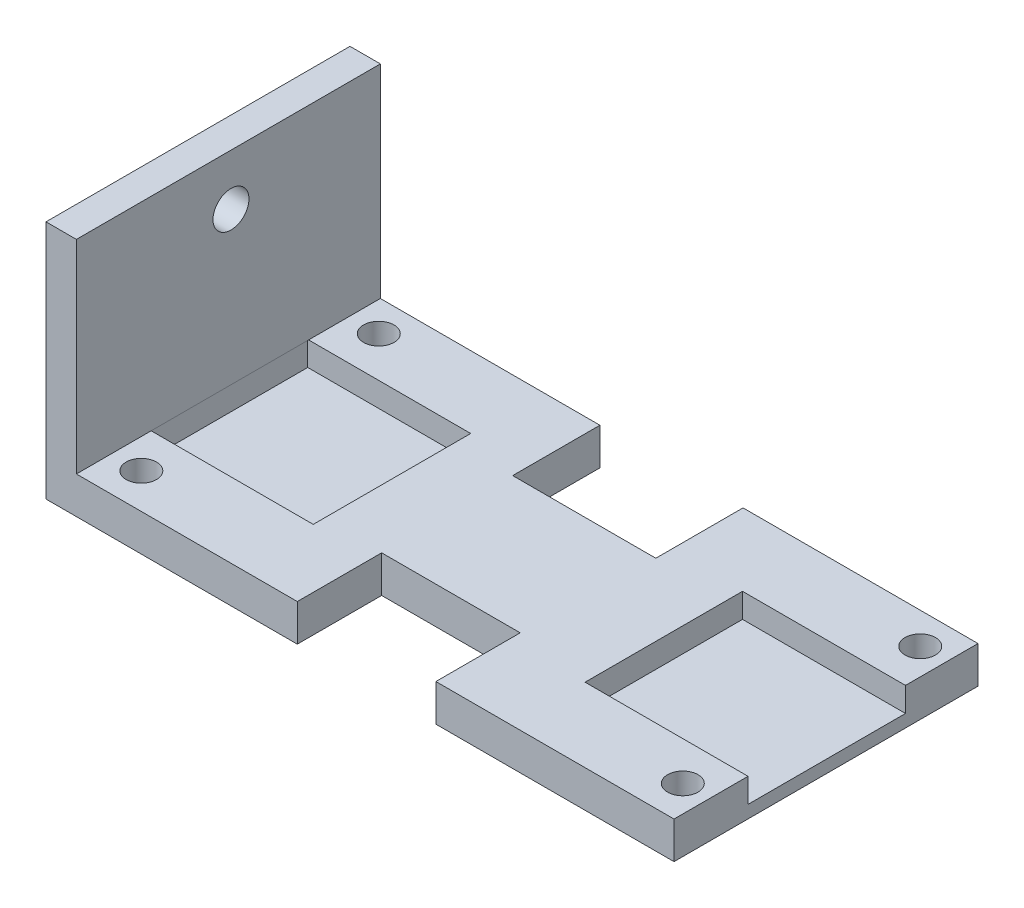
ISO-10303-21;
HEADER;
FILE_DESCRIPTION(('STEP AP214'),'2;1');
FILE_NAME('part.step','',(''),(''),'','','');
FILE_SCHEMA(('AUTOMOTIVE_DESIGN { 1 0 10303 214 1 1 1 1 }'));
ENDSEC;
DATA;
#1=APPLICATION_CONTEXT('core data for automotive mechanical design processes');
#2=APPLICATION_PROTOCOL_DEFINITION('international standard','automotive_design',2000,#1);
#3=PRODUCT_CONTEXT('',#1,'mechanical');
#4=PRODUCT('Part','Part','',(#3));
#5=PRODUCT_RELATED_PRODUCT_CATEGORY('part','',(#4));
#6=PRODUCT_DEFINITION_FORMATION('','',#4);
#7=PRODUCT_DEFINITION_CONTEXT('part definition',#1,'design');
#8=PRODUCT_DEFINITION('design','',#6,#7);
#9=PRODUCT_DEFINITION_SHAPE('','',#8);
#10=(LENGTH_UNIT() NAMED_UNIT(*) SI_UNIT(.MILLI.,.METRE.));
#11=(NAMED_UNIT(*) PLANE_ANGLE_UNIT() SI_UNIT($,.RADIAN.));
#12=(NAMED_UNIT(*) SI_UNIT($,.STERADIAN.) SOLID_ANGLE_UNIT());
#13=UNCERTAINTY_MEASURE_WITH_UNIT(LENGTH_MEASURE(1.E-05),#10,'distance_accuracy_value','');
#14=(GEOMETRIC_REPRESENTATION_CONTEXT(3) GLOBAL_UNCERTAINTY_ASSIGNED_CONTEXT((#13)) GLOBAL_UNIT_ASSIGNED_CONTEXT((#10,
#11,#12)) REPRESENTATION_CONTEXT('',''));
#15=CARTESIAN_POINT('',(0.,0.,0.));
#16=DIRECTION('',(0.,0.,1.));
#17=DIRECTION('',(1.,0.,0.));
#18=AXIS2_PLACEMENT_3D('',#15,#16,#17);
#19=CARTESIAN_POINT('',(-2.54,-12.5566261848398,6.15573617171977));
#20=DIRECTION('',(0.,0.,1.));
#21=DIRECTION('',(1.,0.,0.));
#22=AXIS2_PLACEMENT_3D('',#19,#20,#21);
#23=PLANE('',#22);
#24=DIRECTION('',(1.,0.,0.));
#25=VECTOR('',#24,1.);
#26=CARTESIAN_POINT('',(-2.54,7.5068337961804,6.15573617171977));
#27=LINE('',#26,#25);
#28=CARTESIAN_POINT('',(-2.54,7.5068337961804,6.15573617171977));
#29=VERTEX_POINT('',#28);
#30=CARTESIAN_POINT('',(0.,7.5068337961804,6.15573617171977));
#31=VERTEX_POINT('',#30);
#32=EDGE_CURVE('E191',#29,#31,#27,.T.);
#33=ORIENTED_EDGE('',*,*,#32,.F.);
#34=DIRECTION('',(0.,-1.,0.));
#35=VECTOR('',#34,1.);
#36=CARTESIAN_POINT('',(-2.54,-12.5566261848398,6.15573617171977));
#37=LINE('',#36,#35);
#38=CARTESIAN_POINT('',(-2.54,-12.5566261848398,6.15573617171977));
#39=VERTEX_POINT('',#38);
#40=EDGE_CURVE('E202',#29,#39,#37,.T.);
#41=ORIENTED_EDGE('',*,*,#40,.T.);
#42=DIRECTION('',(1.,0.,0.));
#43=VECTOR('',#42,1.);
#44=CARTESIAN_POINT('',(-2.54,-12.5566261848398,6.15573617171977));
#45=LINE('',#44,#43);
#46=CARTESIAN_POINT('',(18.4588445874283,-12.5566261848398,6.15573617171977));
#47=VERTEX_POINT('',#46);
#48=EDGE_CURVE('E229',#39,#47,#45,.T.);
#49=ORIENTED_EDGE('',*,*,#48,.T.);
#50=DIRECTION('',(0.,-1.,0.));
#51=VECTOR('',#50,1.);
#52=CARTESIAN_POINT('',(18.4588445874283,-12.5566261848398,6.15573617171977));
#53=LINE('',#52,#51);
#54=CARTESIAN_POINT('',(18.4588445874283,-9.46994199872275,6.15573617171976));
#55=VERTEX_POINT('',#54);
#56=EDGE_CURVE('E355',#55,#47,#53,.T.);
#57=ORIENTED_EDGE('',*,*,#56,.F.);
#58=DIRECTION('',(-1.,0.,0.));
#59=VECTOR('',#58,1.);
#60=CARTESIAN_POINT('',(49.9364,-9.46994199872275,6.15573617171977));
#61=LINE('',#60,#59);
#62=CARTESIAN_POINT('',(0.,-9.46994199872275,6.15573617171977));
#63=VERTEX_POINT('',#62);
#64=EDGE_CURVE('E239',#55,#63,#61,.T.);
#65=ORIENTED_EDGE('',*,*,#64,.T.);
#66=DIRECTION('',(0.,-1.,0.));
#67=VECTOR('',#66,1.);
#68=CARTESIAN_POINT('',(0.,-12.5566261848398,6.15573617171977));
#69=LINE('',#68,#67);
#70=EDGE_CURVE('E37',#31,#63,#69,.T.);
#71=ORIENTED_EDGE('',*,*,#70,.F.);
#72=EDGE_LOOP('',(#33,#41,#49,#57,#65,#71));
#73=FACE_BOUND('',#72,.T.);
#74=ADVANCED_FACE('F33',(#73),#23,.T.);
#75=CARTESIAN_POINT('',(-2.54,-12.5566261848398,-19.2442638282802));
#76=DIRECTION('',(0.,0.,-1.));
#77=DIRECTION('',(-1.,0.,0.));
#78=AXIS2_PLACEMENT_3D('',#75,#76,#77);
#79=PLANE('',#78);
#80=DIRECTION('',(1.,0.,0.));
#81=VECTOR('',#80,1.);
#82=CARTESIAN_POINT('',(-2.54,7.5068337961804,-19.2442638282802));
#83=LINE('',#82,#81);
#84=CARTESIAN_POINT('',(-2.54,7.5068337961804,-19.2442638282802));
#85=VERTEX_POINT('',#84);
#86=CARTESIAN_POINT('',(0.,7.5068337961804,-19.2442638282802));
#87=VERTEX_POINT('',#86);
#88=EDGE_CURVE('E50',#85,#87,#83,.T.);
#89=ORIENTED_EDGE('',*,*,#88,.T.);
#90=DIRECTION('',(0.,1.,0.));
#91=VECTOR('',#90,1.);
#92=CARTESIAN_POINT('',(0.,-12.5566261848398,-19.2442638282802));
#93=LINE('',#92,#91);
#94=CARTESIAN_POINT('',(0.,-9.46994199872275,-19.2442638282802));
#95=VERTEX_POINT('',#94);
#96=EDGE_CURVE('E211',#95,#87,#93,.T.);
#97=ORIENTED_EDGE('',*,*,#96,.F.);
#98=DIRECTION('',(-1.,0.,0.));
#99=VECTOR('',#98,1.);
#100=CARTESIAN_POINT('',(49.9364,-9.46994199872275,-19.2442638282802));
#101=LINE('',#100,#99);
#102=CARTESIAN_POINT('',(18.3432816390834,-9.46994199872275,-19.2442638282802));
#103=VERTEX_POINT('',#102);
#104=EDGE_CURVE('E238',#103,#95,#101,.T.);
#105=ORIENTED_EDGE('',*,*,#104,.F.);
#106=DIRECTION('',(0.,1.,0.));
#107=VECTOR('',#106,1.);
#108=CARTESIAN_POINT('',(18.3432816390834,-14.5499419987228,-19.2442638282802));
#109=LINE('',#108,#107);
#110=CARTESIAN_POINT('',(18.3432816390834,-12.5566261848398,-19.2442638282802));
#111=VERTEX_POINT('',#110);
#112=EDGE_CURVE('E365',#111,#103,#109,.T.);
#113=ORIENTED_EDGE('',*,*,#112,.F.);
#114=DIRECTION('',(1.,0.,0.));
#115=VECTOR('',#114,1.);
#116=CARTESIAN_POINT('',(-2.54,-12.5566261848398,-19.2442638282802));
#117=LINE('',#116,#115);
#118=CARTESIAN_POINT('',(-2.54,-12.5566261848398,-19.2442638282802));
#119=VERTEX_POINT('',#118);
#120=EDGE_CURVE('E226',#119,#111,#117,.T.);
#121=ORIENTED_EDGE('',*,*,#120,.F.);
#122=DIRECTION('',(0.,1.,0.));
#123=VECTOR('',#122,1.);
#124=CARTESIAN_POINT('',(-2.54,-12.5566261848398,-19.2442638282802));
#125=LINE('',#124,#123);
#126=EDGE_CURVE('E213',#119,#85,#125,.T.);
#127=ORIENTED_EDGE('',*,*,#126,.T.);
#128=EDGE_LOOP('',(#89,#97,#105,#113,#121,#127));
#129=FACE_BOUND('',#128,.T.);
#130=ADVANCED_FACE('F411',(#129),#79,.T.);
#131=CARTESIAN_POINT('',(0.,0.,0.));
#132=DIRECTION('',(-1.,0.,0.));
#133=DIRECTION('',(0.,0.,1.));
#134=AXIS2_PLACEMENT_3D('',#131,#132,#133);
#135=PLANE('',#134);
#136=CARTESIAN_POINT('',(0.,3.23005800127725,-6.76084043334989));
#137=DIRECTION('',(1.,0.,0.));
#138=DIRECTION('',(0.,0.,-1.));
#139=AXIS2_PLACEMENT_3D('',#136,#137,#138);
#140=CIRCLE('',#139,1.50358371798549);
#141=CARTESIAN_POINT('',(0.,3.23005800127725,-8.26442415133538));
#142=VERTEX_POINT('',#141);
#143=EDGE_CURVE('E378',#142,#142,#140,.T.);
#144=ORIENTED_EDGE('',*,*,#143,.F.);
#145=EDGE_LOOP('',(#144));
#146=FACE_BOUND('',#145,.T.);
#147=ORIENTED_EDGE('',*,*,#96,.T.);
#148=DIRECTION('',(0.,0.,-1.));
#149=VECTOR('',#148,1.);
#150=CARTESIAN_POINT('',(0.,7.5068337961804,6.15573617171977));
#151=LINE('',#150,#149);
#152=EDGE_CURVE('E197',#31,#87,#151,.T.);
#153=ORIENTED_EDGE('',*,*,#152,.F.);
#154=ORIENTED_EDGE('',*,*,#70,.T.);
#155=DIRECTION('',(0.,0.,1.));
#156=VECTOR('',#155,1.);
#157=CARTESIAN_POINT('',(0.,-9.46994199872275,6.15573617171977));
#158=LINE('',#157,#156);
#159=CARTESIAN_POINT('',(0.,-9.46994199872275,-0.0921025046821287));
#160=VERTEX_POINT('',#159);
#161=EDGE_CURVE('E253',#160,#63,#158,.T.);
#162=ORIENTED_EDGE('',*,*,#161,.F.);
#163=CARTESIAN_POINT('',(0.,-9.46994199872275,-13.2482168132869));
#164=VERTEX_POINT('',#163);
#165=EDGE_CURVE('E234',#164,#160,#158,.T.);
#166=ORIENTED_EDGE('',*,*,#165,.F.);
#167=EDGE_CURVE('E230',#95,#164,#158,.T.);
#168=ORIENTED_EDGE('',*,*,#167,.F.);
#169=EDGE_LOOP('',(#147,#153,#154,#162,#166,#168));
#170=FACE_BOUND('',#169,.T.);
#171=ADVANCED_FACE('F417',(#146,#170),#135,.F.);
#172=DIRECTION('',(0.,1.,0.));
#173=VECTOR('',#172,1.);
#174=CARTESIAN_POINT('',(30.0365325988843,-12.5566261848398,6.15573617171977));
#175=LINE('',#174,#173);
#176=CARTESIAN_POINT('',(30.0365325988843,-12.5566261848398,6.15573617171977));
#177=VERTEX_POINT('',#176);
#178=CARTESIAN_POINT('',(30.0365325988843,-9.46994199872275,6.15573617171977));
#179=VERTEX_POINT('',#178);
#180=EDGE_CURVE('E296',#177,#179,#175,.T.);
#181=ORIENTED_EDGE('',*,*,#180,.F.);
#182=CARTESIAN_POINT('',(49.9364,-12.5566261848398,6.15573617171977));
#183=VERTEX_POINT('',#182);
#184=EDGE_CURVE('E221',#177,#183,#45,.T.);
#185=ORIENTED_EDGE('',*,*,#184,.T.);
#186=DIRECTION('',(0.,-1.,0.));
#187=VECTOR('',#186,1.);
#188=CARTESIAN_POINT('',(49.9364,-12.5566261848398,6.15573617171977));
#189=LINE('',#188,#187);
#190=CARTESIAN_POINT('',(49.9364,-9.46994199872275,6.15573617171977));
#191=VERTEX_POINT('',#190);
#192=EDGE_CURVE('E233',#191,#183,#189,.T.);
#193=ORIENTED_EDGE('',*,*,#192,.F.);
#194=EDGE_CURVE('E235',#191,#179,#61,.T.);
#195=ORIENTED_EDGE('',*,*,#194,.T.);
#196=EDGE_LOOP('',(#181,#185,#193,#195));
#197=FACE_BOUND('',#196,.T.);
#198=ADVANCED_FACE('F35',(#197),#23,.T.);
#199=DIRECTION('',(0.,1.,0.));
#200=VECTOR('',#199,1.);
#201=CARTESIAN_POINT('',(30.3037040280991,-14.5499419987228,-19.2442638282802));
#202=LINE('',#201,#200);
#203=CARTESIAN_POINT('',(30.3037040280991,-12.5566261848398,-19.2442638282802));
#204=VERTEX_POINT('',#203);
#205=CARTESIAN_POINT('',(30.3037040280991,-9.46994199872275,-19.2442638282802));
#206=VERTEX_POINT('',#205);
#207=EDGE_CURVE('E311',#204,#206,#202,.T.);
#208=ORIENTED_EDGE('',*,*,#207,.T.);
#209=CARTESIAN_POINT('',(49.9364,-9.46994199872275,-19.2442638282802));
#210=VERTEX_POINT('',#209);
#211=EDGE_CURVE('E242',#210,#206,#101,.T.);
#212=ORIENTED_EDGE('',*,*,#211,.F.);
#213=DIRECTION('',(0.,1.,0.));
#214=VECTOR('',#213,1.);
#215=CARTESIAN_POINT('',(49.9364,-12.5566261848398,-19.2442638282802));
#216=LINE('',#215,#214);
#217=CARTESIAN_POINT('',(49.9364,-12.5566261848398,-19.2442638282802));
#218=VERTEX_POINT('',#217);
#219=EDGE_CURVE('E274',#218,#210,#216,.T.);
#220=ORIENTED_EDGE('',*,*,#219,.F.);
#221=EDGE_CURVE('E304',#204,#218,#117,.T.);
#222=ORIENTED_EDGE('',*,*,#221,.F.);
#223=EDGE_LOOP('',(#208,#212,#220,#222));
#224=FACE_BOUND('',#223,.T.);
#225=ADVANCED_FACE('F309',(#224),#79,.T.);
#226=CARTESIAN_POINT('',(-2.54,-12.5566261848398,6.15573617171977));
#227=DIRECTION('',(0.,-1.,0.));
#228=DIRECTION('',(0.,0.,-1.));
#229=AXIS2_PLACEMENT_3D('',#226,#227,#228);
#230=PLANE('',#229);
#231=DIRECTION('',(0.,0.,-1.));
#232=VECTOR('',#231,1.);
#233=CARTESIAN_POINT('',(18.4588445874283,-12.5566261848398,6.15573617171977));
#234=LINE('',#233,#232);
#235=CARTESIAN_POINT('',(18.4588445874283,-12.5566261848398,-0.892382071924658));
#236=VERTEX_POINT('',#235);
#237=EDGE_CURVE('E353',#47,#236,#234,.T.);
#238=ORIENTED_EDGE('',*,*,#237,.F.);
#239=ORIENTED_EDGE('',*,*,#48,.F.);
#240=DIRECTION('',(0.,0.,-1.));
#241=VECTOR('',#240,1.);
#242=CARTESIAN_POINT('',(-2.54,-12.5566261848398,6.15573617171977));
#243=LINE('',#242,#241);
#244=EDGE_CURVE('E210',#39,#119,#243,.T.);
#245=ORIENTED_EDGE('',*,*,#244,.T.);
#246=ORIENTED_EDGE('',*,*,#120,.T.);
#247=DIRECTION('',(0.,0.,-1.));
#248=VECTOR('',#247,1.);
#249=CARTESIAN_POINT('',(18.3432816390834,-12.5566261848398,6.15573617171977));
#250=LINE('',#249,#248);
#251=CARTESIAN_POINT('',(18.3432816390834,-12.5566261848398,-11.9553812118198));
#252=VERTEX_POINT('',#251);
#253=EDGE_CURVE('E376',#252,#111,#250,.T.);
#254=ORIENTED_EDGE('',*,*,#253,.F.);
#255=DIRECTION('',(-1.,0.,0.));
#256=VECTOR('',#255,1.);
#257=CARTESIAN_POINT('',(-2.54,-12.5566261848398,-11.9553812118198));
#258=LINE('',#257,#256);
#259=CARTESIAN_POINT('',(30.3037040280991,-12.5566261848398,-11.9553812118198));
#260=VERTEX_POINT('',#259);
#261=EDGE_CURVE('E367',#260,#252,#258,.T.);
#262=ORIENTED_EDGE('',*,*,#261,.F.);
#263=DIRECTION('',(0.,0.,1.));
#264=VECTOR('',#263,1.);
#265=CARTESIAN_POINT('',(30.3037040280991,-12.5566261848398,6.15573617171977));
#266=LINE('',#265,#264);
#267=EDGE_CURVE('E374',#204,#260,#266,.T.);
#268=ORIENTED_EDGE('',*,*,#267,.F.);
#269=ORIENTED_EDGE('',*,*,#221,.T.);
#270=DIRECTION('',(0.,0.,-1.));
#271=VECTOR('',#270,1.);
#272=CARTESIAN_POINT('',(49.9364,-12.5566261848398,6.15573617171977));
#273=LINE('',#272,#271);
#274=EDGE_CURVE('E271',#183,#218,#273,.T.);
#275=ORIENTED_EDGE('',*,*,#274,.F.);
#276=ORIENTED_EDGE('',*,*,#184,.F.);
#277=DIRECTION('',(0.,0.,1.));
#278=VECTOR('',#277,1.);
#279=CARTESIAN_POINT('',(30.0365325988843,-12.5566261848398,6.15573617171977));
#280=LINE('',#279,#278);
#281=CARTESIAN_POINT('',(30.0365325988843,-12.5566261848398,-0.892382071924658));
#282=VERTEX_POINT('',#281);
#283=EDGE_CURVE('E347',#282,#177,#280,.T.);
#284=ORIENTED_EDGE('',*,*,#283,.F.);
#285=DIRECTION('',(1.,0.,0.));
#286=VECTOR('',#285,1.);
#287=CARTESIAN_POINT('',(-2.54,-12.5566261848398,-0.892382071924658));
#288=LINE('',#287,#286);
#289=EDGE_CURVE('E351',#236,#282,#288,.T.);
#290=ORIENTED_EDGE('',*,*,#289,.F.);
#291=EDGE_LOOP('',(#238,#239,#245,#246,#254,#262,#268,#269,#275,#276,#284,#290));
#292=FACE_BOUND('',#291,.T.);
#293=CARTESIAN_POINT('',(2.48151774840275,-12.5566261848398,3.21220522318826));
#294=DIRECTION('',(0.,-1.,0.));
#295=DIRECTION('',(0.,0.,-1.));
#296=AXIS2_PLACEMENT_3D('',#293,#294,#295);
#297=CIRCLE('',#296,1.27);
#298=CARTESIAN_POINT('',(2.48151774840275,-12.5566261848398,1.94220522318826));
#299=VERTEX_POINT('',#298);
#300=EDGE_CURVE('E385',#299,#299,#297,.T.);
#301=ORIENTED_EDGE('',*,*,#300,.F.);
#302=EDGE_LOOP('',(#301));
#303=FACE_BOUND('',#302,.T.);
#304=CARTESIAN_POINT('',(47.7235167767742,-12.5566261848398,-16.6307718342857));
#305=DIRECTION('',(0.,-1.,0.));
#306=DIRECTION('',(0.,0.,-1.));
#307=AXIS2_PLACEMENT_3D('',#304,#305,#306);
#308=CIRCLE('',#307,1.27);
#309=CARTESIAN_POINT('',(47.7235167767742,-12.5566261848398,-17.9007718342857));
#310=VERTEX_POINT('',#309);
#311=EDGE_CURVE('E391',#310,#310,#308,.T.);
#312=ORIENTED_EDGE('',*,*,#311,.F.);
#313=EDGE_LOOP('',(#312));
#314=FACE_BOUND('',#313,.T.);
#315=CARTESIAN_POINT('',(47.7252072410046,-12.5566261848398,3.21077959631937));
#316=DIRECTION('',(0.,-1.,0.));
#317=DIRECTION('',(0.,0.,-1.));
#318=AXIS2_PLACEMENT_3D('',#315,#316,#317);
#319=CIRCLE('',#318,1.27);
#320=CARTESIAN_POINT('',(47.7252072410046,-12.5566261848398,1.94077959631938));
#321=VERTEX_POINT('',#320);
#322=EDGE_CURVE('E265',#321,#321,#319,.T.);
#323=ORIENTED_EDGE('',*,*,#322,.F.);
#324=EDGE_LOOP('',(#323));
#325=FACE_BOUND('',#324,.T.);
#326=CARTESIAN_POINT('',(2.47976678337533,-12.5566261848398,-16.6315446995613));
#327=DIRECTION('',(0.,-1.,0.));
#328=DIRECTION('',(0.,0.,-1.));
#329=AXIS2_PLACEMENT_3D('',#326,#327,#328);
#330=CIRCLE('',#329,1.27);
#331=CARTESIAN_POINT('',(2.47976678337533,-12.5566261848398,-17.9015446995613));
#332=VERTEX_POINT('',#331);
#333=EDGE_CURVE('E255',#332,#332,#330,.T.);
#334=ORIENTED_EDGE('',*,*,#333,.F.);
#335=EDGE_LOOP('',(#334));
#336=FACE_BOUND('',#335,.T.);
#337=ADVANCED_FACE('F300',(#292,#303,#314,#325,#336),#230,.T.);
#338=CARTESIAN_POINT('',(-2.54,0.,0.));
#339=DIRECTION('',(-1.,0.,0.));
#340=DIRECTION('',(0.,0.,1.));
#341=AXIS2_PLACEMENT_3D('',#338,#339,#340);
#342=PLANE('',#341);
#343=DIRECTION('',(0.,0.,-1.));
#344=VECTOR('',#343,1.);
#345=CARTESIAN_POINT('',(-2.54,7.5068337961804,6.15573617171977));
#346=LINE('',#345,#344);
#347=EDGE_CURVE('E188',#29,#85,#346,.T.);
#348=ORIENTED_EDGE('',*,*,#347,.T.);
#349=ORIENTED_EDGE('',*,*,#126,.F.);
#350=ORIENTED_EDGE('',*,*,#244,.F.);
#351=ORIENTED_EDGE('',*,*,#40,.F.);
#352=EDGE_LOOP('',(#348,#349,#350,#351));
#353=FACE_BOUND('',#352,.T.);
#354=CARTESIAN_POINT('',(-2.54,3.23005800127725,-6.76084043334989));
#355=DIRECTION('',(-1.,0.,0.));
#356=DIRECTION('',(0.,0.,1.));
#357=AXIS2_PLACEMENT_3D('',#354,#355,#356);
#358=CIRCLE('',#357,1.50358371798549);
#359=CARTESIAN_POINT('',(-2.54,3.23005800127725,-5.2572567153644));
#360=VERTEX_POINT('',#359);
#361=EDGE_CURVE('E381',#360,#360,#358,.T.);
#362=ORIENTED_EDGE('',*,*,#361,.F.);
#363=EDGE_LOOP('',(#362));
#364=FACE_BOUND('',#363,.T.);
#365=ADVANCED_FACE('F207',(#353,#364),#342,.T.);
#366=CARTESIAN_POINT('',(49.9364,-9.46994199872275,6.15573617171977));
#367=DIRECTION('',(0.,-1.,0.));
#368=DIRECTION('',(0.,0.,-1.));
#369=AXIS2_PLACEMENT_3D('',#366,#367,#368);
#370=PLANE('',#369);
#371=CARTESIAN_POINT('',(2.48151774840275,-9.46994199872275,3.21220522318826));
#372=DIRECTION('',(0.,1.,0.));
#373=DIRECTION('',(0.,0.,1.));
#374=AXIS2_PLACEMENT_3D('',#371,#372,#373);
#375=CIRCLE('',#374,1.27);
#376=CARTESIAN_POINT('',(2.48151774840275,-9.46994199872275,4.48220522318826));
#377=VERTEX_POINT('',#376);
#378=EDGE_CURVE('E382',#377,#377,#375,.T.);
#379=ORIENTED_EDGE('',*,*,#378,.F.);
#380=EDGE_LOOP('',(#379));
#381=FACE_BOUND('',#380,.T.);
#382=CARTESIAN_POINT('',(47.7235167767742,-9.46994199872275,-16.6307718342857));
#383=DIRECTION('',(0.,1.,0.));
#384=DIRECTION('',(0.,0.,1.));
#385=AXIS2_PLACEMENT_3D('',#382,#383,#384);
#386=CIRCLE('',#385,1.27);
#387=CARTESIAN_POINT('',(47.7235167767742,-9.46994199872275,-15.3607718342857));
#388=VERTEX_POINT('',#387);
#389=EDGE_CURVE('E388',#388,#388,#386,.T.);
#390=ORIENTED_EDGE('',*,*,#389,.F.);
#391=EDGE_LOOP('',(#390));
#392=FACE_BOUND('',#391,.T.);
#393=CARTESIAN_POINT('',(47.7252072410046,-9.46994199872275,3.21077959631937));
#394=DIRECTION('',(0.,1.,0.));
#395=DIRECTION('',(0.,0.,1.));
#396=AXIS2_PLACEMENT_3D('',#393,#394,#395);
#397=CIRCLE('',#396,1.27);
#398=CARTESIAN_POINT('',(47.7252072410046,-9.46994199872275,4.48077959631937));
#399=VERTEX_POINT('',#398);
#400=EDGE_CURVE('E394',#399,#399,#397,.T.);
#401=ORIENTED_EDGE('',*,*,#400,.F.);
#402=EDGE_LOOP('',(#401));
#403=FACE_BOUND('',#402,.T.);
#404=CARTESIAN_POINT('',(2.47976678337533,-9.46994199872275,-16.6315446995613));
#405=DIRECTION('',(0.,1.,0.));
#406=DIRECTION('',(0.,0.,1.));
#407=AXIS2_PLACEMENT_3D('',#404,#405,#406);
#408=CIRCLE('',#407,1.27);
#409=CARTESIAN_POINT('',(2.47976678337533,-9.46994199872275,-15.3615446995613));
#410=VERTEX_POINT('',#409);
#411=EDGE_CURVE('E260',#410,#410,#408,.T.);
#412=ORIENTED_EDGE('',*,*,#411,.F.);
#413=EDGE_LOOP('',(#412));
#414=FACE_BOUND('',#413,.T.);
#415=DIRECTION('',(0.,0.,-1.));
#416=VECTOR('',#415,1.);
#417=CARTESIAN_POINT('',(13.5423082985329,-9.46994199872275,-13.2482168132869));
#418=LINE('',#417,#416);
#419=CARTESIAN_POINT('',(13.5423082985329,-9.46994199872275,-0.0921025046821287));
#420=VERTEX_POINT('',#419);
#421=CARTESIAN_POINT('',(13.5423082985329,-9.46994199872275,-13.2482168132869));
#422=VERTEX_POINT('',#421);
#423=EDGE_CURVE('E58',#420,#422,#418,.T.);
#424=ORIENTED_EDGE('',*,*,#423,.F.);
#425=DIRECTION('',(-1.,0.,0.));
#426=VECTOR('',#425,1.);
#427=CARTESIAN_POINT('',(49.9364,-9.46994199872275,-0.0921025046821287));
#428=LINE('',#427,#426);
#429=EDGE_CURVE('E11',#420,#160,#428,.T.);
#430=ORIENTED_EDGE('',*,*,#429,.T.);
#431=ORIENTED_EDGE('',*,*,#161,.T.);
#432=ORIENTED_EDGE('',*,*,#64,.F.);
#433=DIRECTION('',(0.,0.,1.));
#434=VECTOR('',#433,1.);
#435=CARTESIAN_POINT('',(18.4588445874283,-9.46994199872275,-0.892382071924658));
#436=LINE('',#435,#434);
#437=CARTESIAN_POINT('',(18.4588445874283,-9.46994199872275,-0.892382071924658));
#438=VERTEX_POINT('',#437);
#439=EDGE_CURVE('E333',#438,#55,#436,.T.);
#440=ORIENTED_EDGE('',*,*,#439,.F.);
#441=DIRECTION('',(-1.,0.,0.));
#442=VECTOR('',#441,1.);
#443=CARTESIAN_POINT('',(18.4588445874283,-9.46994199872275,-0.892382071924658));
#444=LINE('',#443,#442);
#445=CARTESIAN_POINT('',(30.0365325988843,-9.46994199872275,-0.892382071924658));
#446=VERTEX_POINT('',#445);
#447=EDGE_CURVE('E341',#446,#438,#444,.T.);
#448=ORIENTED_EDGE('',*,*,#447,.F.);
#449=DIRECTION('',(0.,0.,1.));
#450=VECTOR('',#449,1.);
#451=CARTESIAN_POINT('',(30.0365325988843,-9.46994199872275,6.15573617171977));
#452=LINE('',#451,#450);
#453=EDGE_CURVE('E43',#446,#179,#452,.T.);
#454=ORIENTED_EDGE('',*,*,#453,.T.);
#455=ORIENTED_EDGE('',*,*,#194,.F.);
#456=DIRECTION('',(0.,0.,1.));
#457=VECTOR('',#456,1.);
#458=CARTESIAN_POINT('',(49.9364,-9.46994199872275,6.15573617171977));
#459=LINE('',#458,#457);
#460=CARTESIAN_POINT('',(49.9364,-9.46994199872275,-0.0291545893299517));
#461=VERTEX_POINT('',#460);
#462=EDGE_CURVE('E275',#461,#191,#459,.T.);
#463=ORIENTED_EDGE('',*,*,#462,.F.);
#464=DIRECTION('',(1.,0.,0.));
#465=VECTOR('',#464,1.);
#466=CARTESIAN_POINT('',(49.9364,-9.46994199872275,-0.0291545893299517));
#467=LINE('',#466,#465);
#468=CARTESIAN_POINT('',(36.3192570281113,-9.46994199872275,-0.0291545893299517));
#469=VERTEX_POINT('',#468);
#470=EDGE_CURVE('E322',#469,#461,#467,.T.);
#471=ORIENTED_EDGE('',*,*,#470,.F.);
#472=DIRECTION('',(0.,0.,1.));
#473=VECTOR('',#472,1.);
#474=CARTESIAN_POINT('',(36.3192570281113,-9.46994199872275,-13.1852688979347));
#475=LINE('',#474,#473);
#476=CARTESIAN_POINT('',(36.3192570281113,-9.46994199872275,-13.1852688979347));
#477=VERTEX_POINT('',#476);
#478=EDGE_CURVE('E318',#477,#469,#475,.T.);
#479=ORIENTED_EDGE('',*,*,#478,.F.);
#480=DIRECTION('',(-1.,0.,0.));
#481=VECTOR('',#480,1.);
#482=CARTESIAN_POINT('',(49.9364,-9.46994199872275,-13.1852688979347));
#483=LINE('',#482,#481);
#484=CARTESIAN_POINT('',(49.9364,-9.46994199872275,-13.1852688979347));
#485=VERTEX_POINT('',#484);
#486=EDGE_CURVE('E316',#485,#477,#483,.T.);
#487=ORIENTED_EDGE('',*,*,#486,.F.);
#488=EDGE_CURVE('E248',#210,#485,#459,.T.);
#489=ORIENTED_EDGE('',*,*,#488,.F.);
#490=ORIENTED_EDGE('',*,*,#211,.T.);
#491=DIRECTION('',(0.,0.,-1.));
#492=VECTOR('',#491,1.);
#493=CARTESIAN_POINT('',(30.3037040280991,-9.46994199872275,-19.2442638282802));
#494=LINE('',#493,#492);
#495=CARTESIAN_POINT('',(30.3037040280991,-9.46994199872275,-11.9553812118198));
#496=VERTEX_POINT('',#495);
#497=EDGE_CURVE('E362',#496,#206,#494,.T.);
#498=ORIENTED_EDGE('',*,*,#497,.F.);
#499=DIRECTION('',(1.,0.,0.));
#500=VECTOR('',#499,1.);
#501=CARTESIAN_POINT('',(18.3432816390834,-9.46994199872275,-11.9553812118198));
#502=LINE('',#501,#500);
#503=CARTESIAN_POINT('',(18.3432816390834,-9.46994199872275,-11.9553812118198));
#504=VERTEX_POINT('',#503);
#505=EDGE_CURVE('E359',#504,#496,#502,.T.);
#506=ORIENTED_EDGE('',*,*,#505,.F.);
#507=DIRECTION('',(0.,0.,1.));
#508=VECTOR('',#507,1.);
#509=CARTESIAN_POINT('',(18.3432816390834,-9.46994199872275,-19.2442638282802));
#510=LINE('',#509,#508);
#511=EDGE_CURVE('E357',#103,#504,#510,.T.);
#512=ORIENTED_EDGE('',*,*,#511,.F.);
#513=ORIENTED_EDGE('',*,*,#104,.T.);
#514=ORIENTED_EDGE('',*,*,#167,.T.);
#515=DIRECTION('',(-1.,0.,0.));
#516=VECTOR('',#515,1.);
#517=CARTESIAN_POINT('',(13.5423082985329,-9.46994199872275,-13.2482168132869));
#518=LINE('',#517,#516);
#519=EDGE_CURVE('E730',#422,#164,#518,.T.);
#520=ORIENTED_EDGE('',*,*,#519,.F.);
#521=EDGE_LOOP('',(#424,#430,#431,#432,#440,#448,#454,#455,#463,#471,#479,#487,#489,#490,#498,
#506,#512,#513,#514,#520));
#522=FACE_BOUND('',#521,.T.);
#523=ADVANCED_FACE('F289',(#381,#392,#403,#414,#522),#370,.F.);
#524=CARTESIAN_POINT('',(49.9364,0.,0.));
#525=DIRECTION('',(-1.,0.,0.));
#526=DIRECTION('',(0.,0.,1.));
#527=AXIS2_PLACEMENT_3D('',#524,#525,#526);
#528=PLANE('',#527);
#529=DIRECTION('',(0.,0.,-1.));
#530=VECTOR('',#529,1.);
#531=CARTESIAN_POINT('',(49.9364,-11.5019419987228,-13.1852688979347));
#532=LINE('',#531,#530);
#533=CARTESIAN_POINT('',(49.9364,-11.5019419987228,-0.0291545893299517));
#534=VERTEX_POINT('',#533);
#535=CARTESIAN_POINT('',(49.9364,-11.5019419987228,-13.1852688979347));
#536=VERTEX_POINT('',#535);
#537=EDGE_CURVE('E331',#534,#536,#532,.T.);
#538=ORIENTED_EDGE('',*,*,#537,.F.);
#539=DIRECTION('',(0.,1.,0.));
#540=VECTOR('',#539,1.);
#541=CARTESIAN_POINT('',(49.9364,-11.5019419987228,-0.0291545893299517));
#542=LINE('',#541,#540);
#543=EDGE_CURVE('E287',#534,#461,#542,.T.);
#544=ORIENTED_EDGE('',*,*,#543,.T.);
#545=ORIENTED_EDGE('',*,*,#462,.T.);
#546=ORIENTED_EDGE('',*,*,#192,.T.);
#547=ORIENTED_EDGE('',*,*,#274,.T.);
#548=ORIENTED_EDGE('',*,*,#219,.T.);
#549=ORIENTED_EDGE('',*,*,#488,.T.);
#550=DIRECTION('',(0.,1.,0.));
#551=VECTOR('',#550,1.);
#552=CARTESIAN_POINT('',(49.9364,-11.5019419987228,-13.1852688979347));
#553=LINE('',#552,#551);
#554=EDGE_CURVE('E338',#536,#485,#553,.T.);
#555=ORIENTED_EDGE('',*,*,#554,.F.);
#556=EDGE_LOOP('',(#538,#544,#545,#546,#547,#548,#549,#555));
#557=FACE_BOUND('',#556,.T.);
#558=ADVANCED_FACE('F284',(#557),#528,.F.);
#559=CARTESIAN_POINT('',(2.47976678337533,-59.4063419987228,-16.6315446995613));
#560=DIRECTION('',(0.,1.,0.));
#561=DIRECTION('',(0.,0.,1.));
#562=AXIS2_PLACEMENT_3D('',#559,#560,#561);
#563=CYLINDRICAL_SURFACE('',#562,1.27);
#564=ORIENTED_EDGE('',*,*,#333,.T.);
#565=EDGE_LOOP('',(#564));
#566=FACE_BOUND('',#565,.T.);
#567=ORIENTED_EDGE('',*,*,#411,.T.);
#568=EDGE_LOOP('',(#567));
#569=FACE_BOUND('',#568,.T.);
#570=ADVANCED_FACE('F435',(#566,#569),#563,.F.);
#571=CARTESIAN_POINT('',(47.7252072410046,-59.4063419987228,3.21077959631937));
#572=DIRECTION('',(0.,1.,0.));
#573=DIRECTION('',(0.,0.,1.));
#574=AXIS2_PLACEMENT_3D('',#571,#572,#573);
#575=CYLINDRICAL_SURFACE('',#574,1.27);
#576=ORIENTED_EDGE('',*,*,#322,.T.);
#577=EDGE_LOOP('',(#576));
#578=FACE_BOUND('',#577,.T.);
#579=ORIENTED_EDGE('',*,*,#400,.T.);
#580=EDGE_LOOP('',(#579));
#581=FACE_BOUND('',#580,.T.);
#582=ADVANCED_FACE('F399',(#578,#581),#575,.F.);
#583=CARTESIAN_POINT('',(47.7235167767742,-59.4063419987228,-16.6307718342857));
#584=DIRECTION('',(0.,1.,0.));
#585=DIRECTION('',(0.,0.,1.));
#586=AXIS2_PLACEMENT_3D('',#583,#584,#585);
#587=CYLINDRICAL_SURFACE('',#586,1.27);
#588=ORIENTED_EDGE('',*,*,#311,.T.);
#589=EDGE_LOOP('',(#588));
#590=FACE_BOUND('',#589,.T.);
#591=ORIENTED_EDGE('',*,*,#389,.T.);
#592=EDGE_LOOP('',(#591));
#593=FACE_BOUND('',#592,.T.);
#594=ADVANCED_FACE('F440',(#590,#593),#587,.F.);
#595=CARTESIAN_POINT('',(2.48151774840275,-59.4063419987228,3.21220522318826));
#596=DIRECTION('',(0.,1.,0.));
#597=DIRECTION('',(0.,0.,1.));
#598=AXIS2_PLACEMENT_3D('',#595,#596,#597);
#599=CYLINDRICAL_SURFACE('',#598,1.27);
#600=ORIENTED_EDGE('',*,*,#300,.T.);
#601=EDGE_LOOP('',(#600));
#602=FACE_BOUND('',#601,.T.);
#603=ORIENTED_EDGE('',*,*,#378,.T.);
#604=EDGE_LOOP('',(#603));
#605=FACE_BOUND('',#604,.T.);
#606=ADVANCED_FACE('F443',(#602,#605),#599,.F.);
#607=CARTESIAN_POINT('',(-49.9364,3.23005800127725,-6.76084043334989));
#608=DIRECTION('',(1.,0.,0.));
#609=DIRECTION('',(0.,0.,-1.));
#610=AXIS2_PLACEMENT_3D('',#607,#608,#609);
#611=CYLINDRICAL_SURFACE('',#610,1.50358371798549);
#612=ORIENTED_EDGE('',*,*,#361,.T.);
#613=EDGE_LOOP('',(#612));
#614=FACE_BOUND('',#613,.T.);
#615=ORIENTED_EDGE('',*,*,#143,.T.);
#616=EDGE_LOOP('',(#615));
#617=FACE_BOUND('',#616,.T.);
#618=ADVANCED_FACE('F447',(#614,#617),#611,.F.);
#619=CARTESIAN_POINT('',(18.3432816390834,-14.5499419987228,-19.2442638282802));
#620=DIRECTION('',(-1.,0.,0.));
#621=DIRECTION('',(0.,0.,1.));
#622=AXIS2_PLACEMENT_3D('',#619,#620,#621);
#623=PLANE('',#622);
#624=ORIENTED_EDGE('',*,*,#253,.T.);
#625=ORIENTED_EDGE('',*,*,#112,.T.);
#626=ORIENTED_EDGE('',*,*,#511,.T.);
#627=DIRECTION('',(0.,1.,0.));
#628=VECTOR('',#627,1.);
#629=CARTESIAN_POINT('',(18.3432816390834,-14.5499419987228,-11.9553812118198));
#630=LINE('',#629,#628);
#631=EDGE_CURVE('E364',#252,#504,#630,.T.);
#632=ORIENTED_EDGE('',*,*,#631,.F.);
#633=EDGE_LOOP('',(#624,#625,#626,#632));
#634=FACE_BOUND('',#633,.T.);
#635=ADVANCED_FACE('F451',(#634),#623,.F.);
#636=CARTESIAN_POINT('',(30.3037040280991,-14.5499419987228,-19.2442638282802));
#637=DIRECTION('',(1.,0.,0.));
#638=DIRECTION('',(0.,0.,-1.));
#639=AXIS2_PLACEMENT_3D('',#636,#637,#638);
#640=PLANE('',#639);
#641=ORIENTED_EDGE('',*,*,#267,.T.);
#642=DIRECTION('',(0.,1.,0.));
#643=VECTOR('',#642,1.);
#644=CARTESIAN_POINT('',(30.3037040280991,-14.5499419987228,-11.9553812118198));
#645=LINE('',#644,#643);
#646=EDGE_CURVE('E369',#260,#496,#645,.T.);
#647=ORIENTED_EDGE('',*,*,#646,.T.);
#648=ORIENTED_EDGE('',*,*,#497,.T.);
#649=ORIENTED_EDGE('',*,*,#207,.F.);
#650=EDGE_LOOP('',(#641,#647,#648,#649));
#651=FACE_BOUND('',#650,.T.);
#652=ADVANCED_FACE('F455',(#651),#640,.F.);
#653=CARTESIAN_POINT('',(18.3432816390834,-14.5499419987228,-11.9553812118198));
#654=DIRECTION('',(0.,0.,1.));
#655=DIRECTION('',(1.,0.,0.));
#656=AXIS2_PLACEMENT_3D('',#653,#654,#655);
#657=PLANE('',#656);
#658=ORIENTED_EDGE('',*,*,#261,.T.);
#659=ORIENTED_EDGE('',*,*,#631,.T.);
#660=ORIENTED_EDGE('',*,*,#505,.T.);
#661=ORIENTED_EDGE('',*,*,#646,.F.);
#662=EDGE_LOOP('',(#658,#659,#660,#661));
#663=FACE_BOUND('',#662,.T.);
#664=ADVANCED_FACE('F457',(#663),#657,.F.);
#665=CARTESIAN_POINT('',(18.4588445874283,-14.5499419987228,-0.892382071924658));
#666=DIRECTION('',(-1.,0.,0.));
#667=DIRECTION('',(0.,0.,1.));
#668=AXIS2_PLACEMENT_3D('',#665,#666,#667);
#669=PLANE('',#668);
#670=ORIENTED_EDGE('',*,*,#56,.T.);
#671=ORIENTED_EDGE('',*,*,#237,.T.);
#672=DIRECTION('',(0.,1.,0.));
#673=VECTOR('',#672,1.);
#674=CARTESIAN_POINT('',(18.4588445874283,-14.5499419987228,-0.892382071924658));
#675=LINE('',#674,#673);
#676=EDGE_CURVE('E345',#236,#438,#675,.T.);
#677=ORIENTED_EDGE('',*,*,#676,.T.);
#678=ORIENTED_EDGE('',*,*,#439,.T.);
#679=EDGE_LOOP('',(#670,#671,#677,#678));
#680=FACE_BOUND('',#679,.T.);
#681=ADVANCED_FACE('F460',(#680),#669,.F.);
#682=CARTESIAN_POINT('',(18.4588445874283,-14.5499419987228,-0.892382071924658));
#683=DIRECTION('',(0.,0.,-1.));
#684=DIRECTION('',(-1.,0.,0.));
#685=AXIS2_PLACEMENT_3D('',#682,#683,#684);
#686=PLANE('',#685);
#687=ORIENTED_EDGE('',*,*,#289,.T.);
#688=DIRECTION('',(0.,1.,0.));
#689=VECTOR('',#688,1.);
#690=CARTESIAN_POINT('',(30.0365325988843,-14.5499419987228,-0.892382071924658));
#691=LINE('',#690,#689);
#692=EDGE_CURVE('E344',#282,#446,#691,.T.);
#693=ORIENTED_EDGE('',*,*,#692,.T.);
#694=ORIENTED_EDGE('',*,*,#447,.T.);
#695=ORIENTED_EDGE('',*,*,#676,.F.);
#696=EDGE_LOOP('',(#687,#693,#694,#695));
#697=FACE_BOUND('',#696,.T.);
#698=ADVANCED_FACE('F467',(#697),#686,.F.);
#699=CARTESIAN_POINT('',(30.0365325988843,-14.5499419987228,-0.892382071924658));
#700=DIRECTION('',(1.,0.,0.));
#701=DIRECTION('',(0.,0.,-1.));
#702=AXIS2_PLACEMENT_3D('',#699,#700,#701);
#703=PLANE('',#702);
#704=ORIENTED_EDGE('',*,*,#180,.T.);
#705=ORIENTED_EDGE('',*,*,#453,.F.);
#706=ORIENTED_EDGE('',*,*,#692,.F.);
#707=ORIENTED_EDGE('',*,*,#283,.T.);
#708=EDGE_LOOP('',(#704,#705,#706,#707));
#709=FACE_BOUND('',#708,.T.);
#710=ADVANCED_FACE('F469',(#709),#703,.F.);
#711=CARTESIAN_POINT('',(49.9364,-11.5019419987228,-0.0291545893299517));
#712=DIRECTION('',(0.,0.,1.));
#713=DIRECTION('',(1.,0.,0.));
#714=AXIS2_PLACEMENT_3D('',#711,#712,#713);
#715=PLANE('',#714);
#716=ORIENTED_EDGE('',*,*,#470,.T.);
#717=ORIENTED_EDGE('',*,*,#543,.F.);
#718=DIRECTION('',(1.,0.,0.));
#719=VECTOR('',#718,1.);
#720=CARTESIAN_POINT('',(49.9364,-11.5019419987228,-0.0291545893299517));
#721=LINE('',#720,#719);
#722=CARTESIAN_POINT('',(36.3192570281113,-11.5019419987228,-0.0291545893299517));
#723=VERTEX_POINT('',#722);
#724=EDGE_CURVE('E327',#723,#534,#721,.T.);
#725=ORIENTED_EDGE('',*,*,#724,.F.);
#726=DIRECTION('',(0.,1.,0.));
#727=VECTOR('',#726,1.);
#728=CARTESIAN_POINT('',(36.3192570281113,-11.5019419987228,-0.0291545893299517));
#729=LINE('',#728,#727);
#730=EDGE_CURVE('E334',#723,#469,#729,.T.);
#731=ORIENTED_EDGE('',*,*,#730,.T.);
#732=EDGE_LOOP('',(#716,#717,#725,#731));
#733=FACE_BOUND('',#732,.T.);
#734=ADVANCED_FACE('F472',(#733),#715,.F.);
#735=CARTESIAN_POINT('',(36.3192570281113,-11.5019419987228,-13.1852688979347));
#736=DIRECTION('',(-1.,0.,0.));
#737=DIRECTION('',(0.,0.,1.));
#738=AXIS2_PLACEMENT_3D('',#735,#736,#737);
#739=PLANE('',#738);
#740=ORIENTED_EDGE('',*,*,#478,.T.);
#741=ORIENTED_EDGE('',*,*,#730,.F.);
#742=DIRECTION('',(0.,0.,1.));
#743=VECTOR('',#742,1.);
#744=CARTESIAN_POINT('',(36.3192570281113,-11.5019419987228,-13.1852688979347));
#745=LINE('',#744,#743);
#746=CARTESIAN_POINT('',(36.3192570281113,-11.5019419987228,-13.1852688979347));
#747=VERTEX_POINT('',#746);
#748=EDGE_CURVE('E744',#747,#723,#745,.T.);
#749=ORIENTED_EDGE('',*,*,#748,.F.);
#750=DIRECTION('',(0.,1.,0.));
#751=VECTOR('',#750,1.);
#752=CARTESIAN_POINT('',(36.3192570281113,-11.5019419987228,-13.1852688979347));
#753=LINE('',#752,#751);
#754=EDGE_CURVE('E336',#747,#477,#753,.T.);
#755=ORIENTED_EDGE('',*,*,#754,.T.);
#756=EDGE_LOOP('',(#740,#741,#749,#755));
#757=FACE_BOUND('',#756,.T.);
#758=ADVANCED_FACE('F481',(#757),#739,.F.);
#759=CARTESIAN_POINT('',(49.9364,-11.5019419987228,-13.1852688979347));
#760=DIRECTION('',(0.,0.,-1.));
#761=DIRECTION('',(-1.,0.,0.));
#762=AXIS2_PLACEMENT_3D('',#759,#760,#761);
#763=PLANE('',#762);
#764=ORIENTED_EDGE('',*,*,#486,.T.);
#765=ORIENTED_EDGE('',*,*,#754,.F.);
#766=DIRECTION('',(-1.,0.,0.));
#767=VECTOR('',#766,1.);
#768=CARTESIAN_POINT('',(49.9364,-11.5019419987228,-13.1852688979347));
#769=LINE('',#768,#767);
#770=EDGE_CURVE('E742',#536,#747,#769,.T.);
#771=ORIENTED_EDGE('',*,*,#770,.F.);
#772=ORIENTED_EDGE('',*,*,#554,.T.);
#773=EDGE_LOOP('',(#764,#765,#771,#772));
#774=FACE_BOUND('',#773,.T.);
#775=ADVANCED_FACE('F477',(#774),#763,.F.);
#776=CARTESIAN_POINT('',(0.,-11.5019419987228,0.));
#777=DIRECTION('',(0.,-1.,0.));
#778=DIRECTION('',(0.,0.,-1.));
#779=AXIS2_PLACEMENT_3D('',#776,#777,#778);
#780=PLANE('',#779);
#781=ORIENTED_EDGE('',*,*,#537,.T.);
#782=ORIENTED_EDGE('',*,*,#770,.T.);
#783=ORIENTED_EDGE('',*,*,#748,.T.);
#784=ORIENTED_EDGE('',*,*,#724,.T.);
#785=EDGE_LOOP('',(#781,#782,#783,#784));
#786=FACE_BOUND('',#785,.T.);
#787=ADVANCED_FACE('F480',(#786),#780,.F.);
#788=CARTESIAN_POINT('',(0.,-9.46994199872275,0.));
#789=DIRECTION('',(0.,-1.,0.));
#790=DIRECTION('',(0.,0.,-1.));
#791=AXIS2_PLACEMENT_3D('',#788,#789,#790);
#792=PLANE('',#791);
#793=ORIENTED_EDGE('',*,*,#165,.T.);
#794=DIRECTION('',(1.,0.,0.));
#795=VECTOR('',#794,1.);
#796=CARTESIAN_POINT('',(13.5423082985329,-9.46994199872275,-0.0921025046821287));
#797=LINE('',#796,#795);
#798=CARTESIAN_POINT('',(-0.0748346733557871,-9.46994199872275,-0.0921025046821287));
#799=VERTEX_POINT('',#798);
#800=EDGE_CURVE('E716',#799,#160,#797,.T.);
#801=ORIENTED_EDGE('',*,*,#800,.F.);
#802=DIRECTION('',(0.,0.,1.));
#803=VECTOR('',#802,1.);
#804=CARTESIAN_POINT('',(-0.0748346733557871,-9.46994199872275,-13.2482168132869));
#805=LINE('',#804,#803);
#806=CARTESIAN_POINT('',(-0.0748346733557871,-9.46994199872275,-13.2482168132869));
#807=VERTEX_POINT('',#806);
#808=EDGE_CURVE('E721',#807,#799,#805,.T.);
#809=ORIENTED_EDGE('',*,*,#808,.F.);
#810=EDGE_CURVE('E729',#164,#807,#518,.T.);
#811=ORIENTED_EDGE('',*,*,#810,.F.);
#812=EDGE_LOOP('',(#793,#801,#809,#811));
#813=FACE_BOUND('',#812,.T.);
#814=ADVANCED_FACE('F490',(#813),#792,.T.);
#815=CARTESIAN_POINT('',(13.5423082985329,-11.5019419987228,-13.2482168132869));
#816=DIRECTION('',(1.,0.,0.));
#817=DIRECTION('',(0.,0.,-1.));
#818=AXIS2_PLACEMENT_3D('',#815,#816,#817);
#819=PLANE('',#818);
#820=ORIENTED_EDGE('',*,*,#423,.T.);
#821=DIRECTION('',(0.,1.,0.));
#822=VECTOR('',#821,1.);
#823=CARTESIAN_POINT('',(13.5423082985329,-11.5019419987228,-13.2482168132869));
#824=LINE('',#823,#822);
#825=CARTESIAN_POINT('',(13.5423082985329,-11.5019419987228,-13.2482168132869));
#826=VERTEX_POINT('',#825);
#827=EDGE_CURVE('E727',#826,#422,#824,.T.);
#828=ORIENTED_EDGE('',*,*,#827,.F.);
#829=DIRECTION('',(0.,0.,-1.));
#830=VECTOR('',#829,1.);
#831=CARTESIAN_POINT('',(13.5423082985329,-11.5019419987228,-13.2482168132869));
#832=LINE('',#831,#830);
#833=CARTESIAN_POINT('',(13.5423082985329,-11.5019419987228,-0.0921025046821287));
#834=VERTEX_POINT('',#833);
#835=EDGE_CURVE('E710',#834,#826,#832,.T.);
#836=ORIENTED_EDGE('',*,*,#835,.F.);
#837=DIRECTION('',(0.,1.,0.));
#838=VECTOR('',#837,1.);
#839=CARTESIAN_POINT('',(13.5423082985329,-11.5019419987228,-0.0921025046821287));
#840=LINE('',#839,#838);
#841=EDGE_CURVE('E320',#834,#420,#840,.T.);
#842=ORIENTED_EDGE('',*,*,#841,.T.);
#843=EDGE_LOOP('',(#820,#828,#836,#842));
#844=FACE_BOUND('',#843,.T.);
#845=ADVANCED_FACE('F492',(#844),#819,.F.);
#846=CARTESIAN_POINT('',(13.5423082985329,-11.5019419987228,-0.0921025046821287));
#847=DIRECTION('',(0.,0.,1.));
#848=DIRECTION('',(1.,0.,0.));
#849=AXIS2_PLACEMENT_3D('',#846,#847,#848);
#850=PLANE('',#849);
#851=ORIENTED_EDGE('',*,*,#800,.T.);
#852=ORIENTED_EDGE('',*,*,#429,.F.);
#853=ORIENTED_EDGE('',*,*,#841,.F.);
#854=DIRECTION('',(1.,0.,0.));
#855=VECTOR('',#854,1.);
#856=CARTESIAN_POINT('',(13.5423082985329,-11.5019419987228,-0.0921025046821287));
#857=LINE('',#856,#855);
#858=CARTESIAN_POINT('',(-0.0748346733557871,-11.5019419987228,-0.0921025046821287));
#859=VERTEX_POINT('',#858);
#860=EDGE_CURVE('E715',#859,#834,#857,.T.);
#861=ORIENTED_EDGE('',*,*,#860,.F.);
#862=DIRECTION('',(0.,1.,0.));
#863=VECTOR('',#862,1.);
#864=CARTESIAN_POINT('',(-0.0748346733557871,-11.5019419987228,-0.0921025046821287));
#865=LINE('',#864,#863);
#866=EDGE_CURVE('E324',#859,#799,#865,.T.);
#867=ORIENTED_EDGE('',*,*,#866,.T.);
#868=EDGE_LOOP('',(#851,#852,#853,#861,#867));
#869=FACE_BOUND('',#868,.T.);
#870=ADVANCED_FACE('F495',(#869),#850,.F.);
#871=CARTESIAN_POINT('',(-0.0748346733557871,-11.5019419987228,-13.2482168132869));
#872=DIRECTION('',(-1.,0.,0.));
#873=DIRECTION('',(0.,0.,1.));
#874=AXIS2_PLACEMENT_3D('',#871,#872,#873);
#875=PLANE('',#874);
#876=ORIENTED_EDGE('',*,*,#808,.T.);
#877=ORIENTED_EDGE('',*,*,#866,.F.);
#878=DIRECTION('',(0.,0.,1.));
#879=VECTOR('',#878,1.);
#880=CARTESIAN_POINT('',(-0.0748346733557871,-11.5019419987228,-13.2482168132869));
#881=LINE('',#880,#879);
#882=CARTESIAN_POINT('',(-0.0748346733557871,-11.5019419987228,-13.2482168132869));
#883=VERTEX_POINT('',#882);
#884=EDGE_CURVE('E718',#883,#859,#881,.T.);
#885=ORIENTED_EDGE('',*,*,#884,.F.);
#886=DIRECTION('',(0.,1.,0.));
#887=VECTOR('',#886,1.);
#888=CARTESIAN_POINT('',(-0.0748346733557871,-11.5019419987228,-13.2482168132869));
#889=LINE('',#888,#887);
#890=EDGE_CURVE('E736',#883,#807,#889,.T.);
#891=ORIENTED_EDGE('',*,*,#890,.T.);
#892=EDGE_LOOP('',(#876,#877,#885,#891));
#893=FACE_BOUND('',#892,.T.);
#894=ADVANCED_FACE('F500',(#893),#875,.F.);
#895=CARTESIAN_POINT('',(13.5423082985329,-11.5019419987228,-13.2482168132869));
#896=DIRECTION('',(0.,0.,-1.));
#897=DIRECTION('',(-1.,0.,0.));
#898=AXIS2_PLACEMENT_3D('',#895,#896,#897);
#899=PLANE('',#898);
#900=ORIENTED_EDGE('',*,*,#519,.T.);
#901=ORIENTED_EDGE('',*,*,#810,.T.);
#902=ORIENTED_EDGE('',*,*,#890,.F.);
#903=DIRECTION('',(-1.,0.,0.));
#904=VECTOR('',#903,1.);
#905=CARTESIAN_POINT('',(13.5423082985329,-11.5019419987228,-13.2482168132869));
#906=LINE('',#905,#904);
#907=EDGE_CURVE('E713',#826,#883,#906,.T.);
#908=ORIENTED_EDGE('',*,*,#907,.F.);
#909=ORIENTED_EDGE('',*,*,#827,.T.);
#910=EDGE_LOOP('',(#900,#901,#902,#908,#909));
#911=FACE_BOUND('',#910,.T.);
#912=ADVANCED_FACE('F496',(#911),#899,.F.);
#913=CARTESIAN_POINT('',(0.,-11.5019419987228,0.));
#914=DIRECTION('',(0.,-1.,0.));
#915=DIRECTION('',(0.,0.,-1.));
#916=AXIS2_PLACEMENT_3D('',#913,#914,#915);
#917=PLANE('',#916);
#918=ORIENTED_EDGE('',*,*,#835,.T.);
#919=ORIENTED_EDGE('',*,*,#907,.T.);
#920=ORIENTED_EDGE('',*,*,#884,.T.);
#921=ORIENTED_EDGE('',*,*,#860,.T.);
#922=EDGE_LOOP('',(#918,#919,#920,#921));
#923=FACE_BOUND('',#922,.T.);
#924=ADVANCED_FACE('F499',(#923),#917,.F.);
#925=CARTESIAN_POINT('',(-2.54,7.5068337961804,6.15573617171977));
#926=DIRECTION('',(0.,-1.,0.));
#927=DIRECTION('',(0.,0.,-1.));
#928=AXIS2_PLACEMENT_3D('',#925,#926,#927);
#929=PLANE('',#928);
#930=ORIENTED_EDGE('',*,*,#152,.T.);
#931=ORIENTED_EDGE('',*,*,#88,.F.);
#932=ORIENTED_EDGE('',*,*,#347,.F.);
#933=ORIENTED_EDGE('',*,*,#32,.T.);
#934=EDGE_LOOP('',(#930,#931,#932,#933));
#935=FACE_BOUND('',#934,.T.);
#936=ADVANCED_FACE('F190',(#935),#929,.F.);
#937=CLOSED_SHELL('',(#74,#130,#171,#198,#225,#337,#365,#523,#558,#570,#582,#594,#606,#618,#635,
#652,#664,#681,#698,#710,#734,#758,#775,#787,#814,#845,#870,#894,#912,#924,#936));
#938=MANIFOLD_SOLID_BREP('B2',#937);
#939=ADVANCED_BREP_SHAPE_REPRESENTATION('',(#18,#938),#14);
#940=SHAPE_DEFINITION_REPRESENTATION(#9,#939);
ENDSEC;
END-ISO-10303-21;
